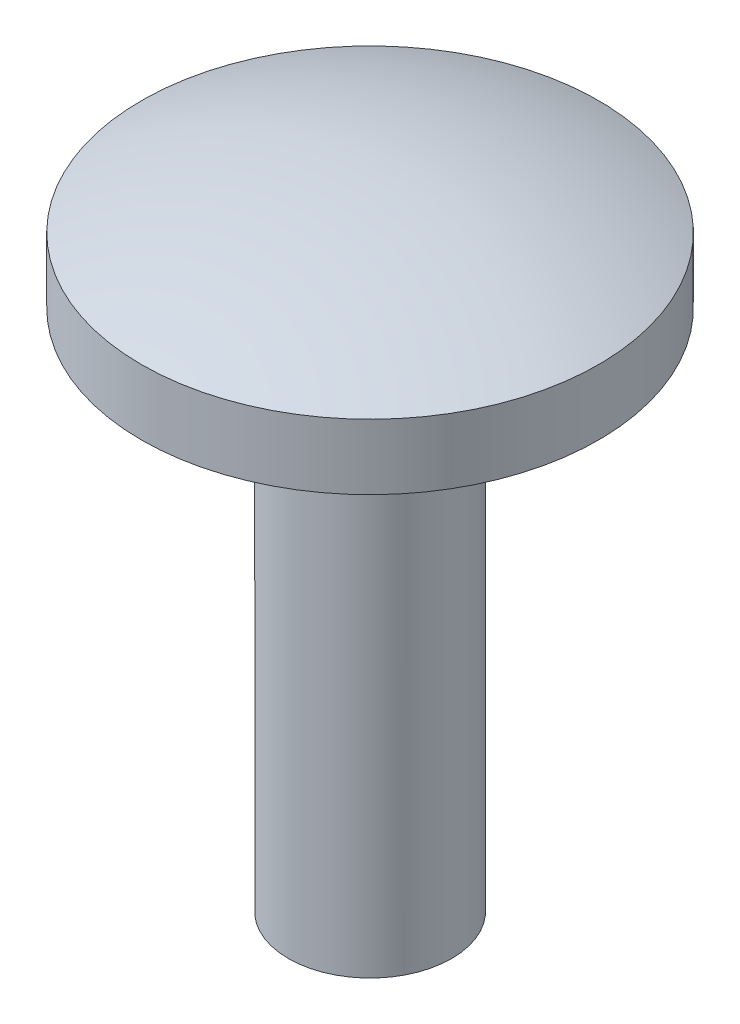
ISO-10303-21;
HEADER;
FILE_DESCRIPTION(('STEP AP214'),'2;1');
FILE_NAME('part.step','',(''),(''),'','','');
FILE_SCHEMA(('AUTOMOTIVE_DESIGN { 1 0 10303 214 1 1 1 1 }'));
ENDSEC;
DATA;
#1=APPLICATION_CONTEXT('core data for automotive mechanical design processes');
#2=APPLICATION_PROTOCOL_DEFINITION('international standard','automotive_design',2000,#1);
#3=PRODUCT_CONTEXT('',#1,'mechanical');
#4=PRODUCT('Part','Part','',(#3));
#5=PRODUCT_RELATED_PRODUCT_CATEGORY('part','',(#4));
#6=PRODUCT_DEFINITION_FORMATION('','',#4);
#7=PRODUCT_DEFINITION_CONTEXT('part definition',#1,'design');
#8=PRODUCT_DEFINITION('design','',#6,#7);
#9=PRODUCT_DEFINITION_SHAPE('','',#8);
#10=(LENGTH_UNIT() NAMED_UNIT(*) SI_UNIT(.MILLI.,.METRE.));
#11=(NAMED_UNIT(*) PLANE_ANGLE_UNIT() SI_UNIT($,.RADIAN.));
#12=(NAMED_UNIT(*) SI_UNIT($,.STERADIAN.) SOLID_ANGLE_UNIT());
#13=UNCERTAINTY_MEASURE_WITH_UNIT(LENGTH_MEASURE(1.E-05),#10,'distance_accuracy_value','');
#14=(GEOMETRIC_REPRESENTATION_CONTEXT(3) GLOBAL_UNCERTAINTY_ASSIGNED_CONTEXT((#13)) GLOBAL_UNIT_ASSIGNED_CONTEXT((#10,
#11,#12)) REPRESENTATION_CONTEXT('',''));
#15=CARTESIAN_POINT('',(0.,0.,0.));
#16=DIRECTION('',(0.,0.,1.));
#17=DIRECTION('',(1.,0.,0.));
#18=AXIS2_PLACEMENT_3D('',#15,#16,#17);
#19=CARTESIAN_POINT('',(0.,0.,0.));
#20=DIRECTION('',(0.,1.,0.));
#21=DIRECTION('',(0.,0.,1.));
#22=AXIS2_PLACEMENT_3D('',#19,#20,#21);
#23=PLANE('',#22);
#24=CARTESIAN_POINT('',(0.,0.,0.));
#25=DIRECTION('',(0.,1.,0.));
#26=DIRECTION('',(0.,0.,1.));
#27=AXIS2_PLACEMENT_3D('',#24,#25,#26);
#28=CIRCLE('',#27,3.5);
#29=CARTESIAN_POINT('',(0.,0.,3.5));
#30=VERTEX_POINT('',#29);
#31=EDGE_CURVE('E42',#30,#30,#28,.T.);
#32=ORIENTED_EDGE('',*,*,#31,.F.);
#33=EDGE_LOOP('',(#32));
#34=FACE_BOUND('',#33,.T.);
#35=CARTESIAN_POINT('',(0.,0.,0.));
#36=DIRECTION('',(0.,1.,0.));
#37=DIRECTION('',(0.,0.,1.));
#38=AXIS2_PLACEMENT_3D('',#35,#36,#37);
#39=CIRCLE('',#38,1.25);
#40=CARTESIAN_POINT('',(0.,0.,1.25));
#41=VERTEX_POINT('',#40);
#42=EDGE_CURVE('E10',#41,#41,#39,.F.);
#43=ORIENTED_EDGE('',*,*,#42,.F.);
#44=EDGE_LOOP('',(#43));
#45=FACE_BOUND('',#44,.T.);
#46=ADVANCED_FACE('F31',(#34,#45),#23,.F.);
#47=CARTESIAN_POINT('',(0.,1.,0.));
#48=DIRECTION('',(0.,-1.,0.));
#49=DIRECTION('',(0.,0.,-1.));
#50=AXIS2_PLACEMENT_3D('',#47,#48,#49);
#51=CYLINDRICAL_SURFACE('',#50,3.5);
#52=CARTESIAN_POINT('',(0.,1.,0.));
#53=DIRECTION('',(0.,1.,0.));
#54=DIRECTION('',(0.,0.,1.));
#55=AXIS2_PLACEMENT_3D('',#52,#53,#54);
#56=CIRCLE('',#55,3.5);
#57=CARTESIAN_POINT('',(0.,1.,3.5));
#58=VERTEX_POINT('',#57);
#59=EDGE_CURVE('E38',#58,#58,#56,.T.);
#60=ORIENTED_EDGE('',*,*,#59,.F.);
#61=EDGE_LOOP('',(#60));
#62=FACE_BOUND('',#61,.T.);
#63=ORIENTED_EDGE('',*,*,#31,.T.);
#64=EDGE_LOOP('',(#63));
#65=FACE_BOUND('',#64,.T.);
#66=ADVANCED_FACE('F62',(#62,#65),#51,.T.);
#67=CARTESIAN_POINT('',(0.,-6.79166666666666,0.));
#68=DIRECTION('',(0.,0.,1.));
#69=DIRECTION('',(1.,0.,0.));
#70=AXIS2_PLACEMENT_3D('',#67,#68,#69);
#71=SPHERICAL_SURFACE('',#70,8.54166666666666);
#72=CARTESIAN_POINT('',(0.,-6.79166666666666,0.));
#73=DIRECTION('',(0.,1.,0.));
#74=DIRECTION('',(0.,0.,1.));
#75=AXIS2_PLACEMENT_3D('',#72,#73,#74);
#76=SPHERICAL_SURFACE('',#75,8.54166666666666);
#77=ORIENTED_EDGE('',*,*,#59,.T.);
#78=EDGE_LOOP('',(#77));
#79=FACE_BOUND('',#78,.T.);
#80=ADVANCED_FACE('F33',(#79),#76,.T.);
#81=CARTESIAN_POINT('',(0.,-8.,0.));
#82=DIRECTION('',(0.,1.,0.));
#83=DIRECTION('',(0.,0.,1.));
#84=AXIS2_PLACEMENT_3D('',#81,#82,#83);
#85=CYLINDRICAL_SURFACE('',#84,1.25);
#86=CARTESIAN_POINT('',(0.,-8.,0.));
#87=DIRECTION('',(0.,-1.,0.));
#88=DIRECTION('',(0.,0.,-1.));
#89=AXIS2_PLACEMENT_3D('',#86,#87,#88);
#90=CIRCLE('',#89,1.25);
#91=CARTESIAN_POINT('',(0.,-8.,-1.25));
#92=VERTEX_POINT('',#91);
#93=EDGE_CURVE('E46',#92,#92,#90,.T.);
#94=ORIENTED_EDGE('',*,*,#93,.F.);
#95=EDGE_LOOP('',(#94));
#96=FACE_BOUND('',#95,.T.);
#97=ORIENTED_EDGE('',*,*,#42,.T.);
#98=EDGE_LOOP('',(#97));
#99=FACE_BOUND('',#98,.T.);
#100=ADVANCED_FACE('F54',(#96,#99),#85,.T.);
#101=CARTESIAN_POINT('',(0.,-8.,0.));
#102=DIRECTION('',(0.,-1.,0.));
#103=DIRECTION('',(0.,0.,-1.));
#104=AXIS2_PLACEMENT_3D('',#101,#102,#103);
#105=PLANE('',#104);
#106=ORIENTED_EDGE('',*,*,#93,.T.);
#107=EDGE_LOOP('',(#106));
#108=FACE_BOUND('',#107,.T.);
#109=ADVANCED_FACE('F52',(#108),#105,.T.);
#110=CLOSED_SHELL('',(#46,#66,#80,#100,#109));
#111=MANIFOLD_SOLID_BREP('B2',#110);
#112=ADVANCED_BREP_SHAPE_REPRESENTATION('',(#18,#111),#14);
#113=SHAPE_DEFINITION_REPRESENTATION(#9,#112);
ENDSEC;
END-ISO-10303-21;
